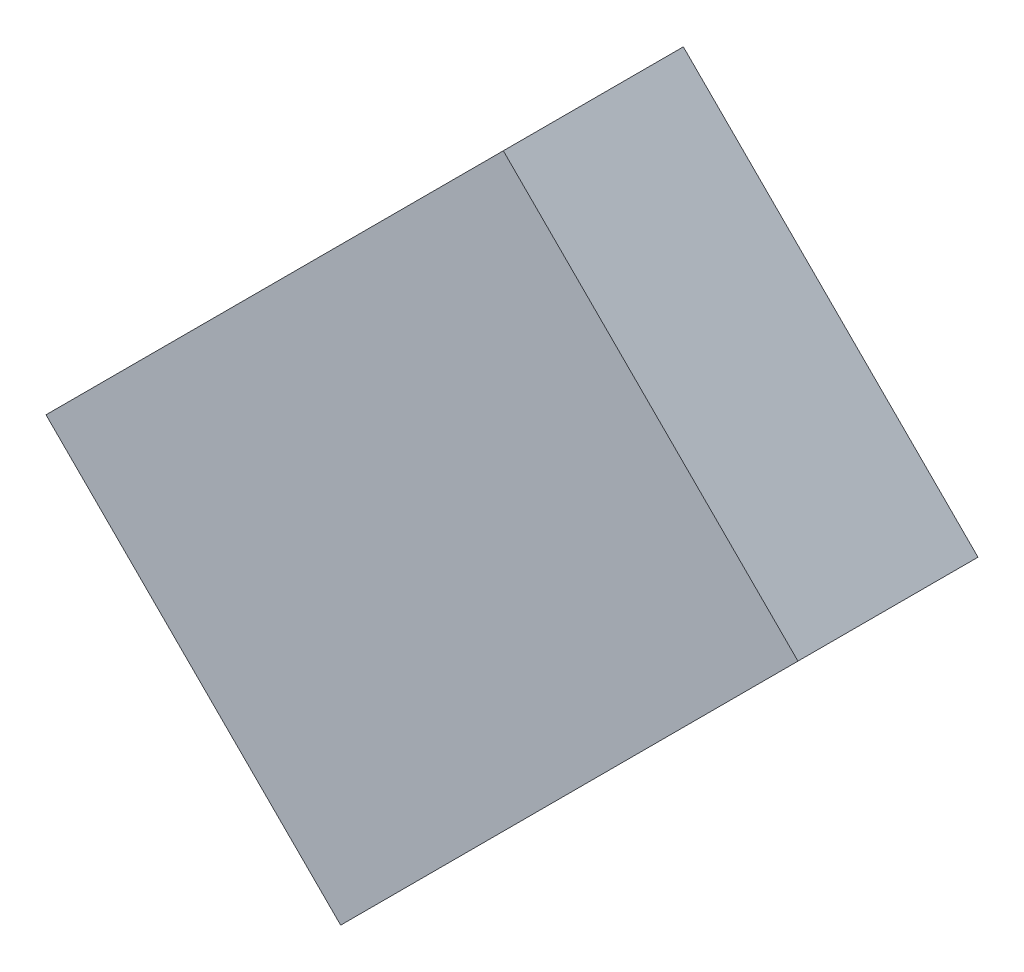
ISO-10303-21;
HEADER;
FILE_DESCRIPTION(('STEP AP214'),'2;1');
FILE_NAME('part.step','',(''),(''),'','','');
FILE_SCHEMA(('AUTOMOTIVE_DESIGN { 1 0 10303 214 1 1 1 1 }'));
ENDSEC;
DATA;
#1=APPLICATION_CONTEXT('core data for automotive mechanical design processes');
#2=APPLICATION_PROTOCOL_DEFINITION('international standard','automotive_design',2000,#1);
#3=PRODUCT_CONTEXT('',#1,'mechanical');
#4=PRODUCT('Part','Part','',(#3));
#5=PRODUCT_RELATED_PRODUCT_CATEGORY('part','',(#4));
#6=PRODUCT_DEFINITION_FORMATION('','',#4);
#7=PRODUCT_DEFINITION_CONTEXT('part definition',#1,'design');
#8=PRODUCT_DEFINITION('design','',#6,#7);
#9=PRODUCT_DEFINITION_SHAPE('','',#8);
#10=(LENGTH_UNIT() NAMED_UNIT(*) SI_UNIT(.MILLI.,.METRE.));
#11=(NAMED_UNIT(*) PLANE_ANGLE_UNIT() SI_UNIT($,.RADIAN.));
#12=(NAMED_UNIT(*) SI_UNIT($,.STERADIAN.) SOLID_ANGLE_UNIT());
#13=UNCERTAINTY_MEASURE_WITH_UNIT(LENGTH_MEASURE(1.E-05),#10,'distance_accuracy_value','');
#14=(GEOMETRIC_REPRESENTATION_CONTEXT(3) GLOBAL_UNCERTAINTY_ASSIGNED_CONTEXT((#13)) GLOBAL_UNIT_ASSIGNED_CONTEXT((#10,
#11,#12)) REPRESENTATION_CONTEXT('',''));
#15=CARTESIAN_POINT('',(0.,0.,0.));
#16=DIRECTION('',(0.,0.,1.));
#17=DIRECTION('',(1.,0.,0.));
#18=AXIS2_PLACEMENT_3D('',#15,#16,#17);
#19=CARTESIAN_POINT('',(-22.7428134217766,-1.20016133795845,0.0240009761019317));
#20=CARTESIAN_POINT('',(-22.7428134017478,-1.20016130133728,-0.623999023898068));
#21=CARTESIAN_POINT('',(-21.0966688351743,0.445983248643856,0.0240011200124011));
#22=CARTESIAN_POINT('',(-21.0966688151455,0.445983285265022,-0.623998879987599));
#23=(BOUNDED_SURFACE() B_SPLINE_SURFACE(1,1,((#19,#20),(#21,#22)),.UNSPECIFIED.,.F.,.F.,
.F.) B_SPLINE_SURFACE_WITH_KNOTS((2,2),(2,2),(-0.00116400000000004,0.001164),(-2.4E-05,
0.000624),.UNSPECIFIED.) GEOMETRIC_REPRESENTATION_ITEM() RATIONAL_B_SPLINE_SURFACE(((1.,1.),(1.,1.))) REPRESENTATION_ITEM('') SURFACE());
#24=CARTESIAN_POINT('',(-21.2338475323648,0.308804566663068,-0.569998891980138));
#25=CARTESIAN_POINT('',(-21.2338475490554,0.30880453614543,-0.029998891980138));
#26=(BOUNDED_CURVE() B_SPLINE_CURVE(1,(#24,#25),.UNSPECIFIED.,.F.,
.F.) B_SPLINE_CURVE_WITH_KNOTS((2,2),(-0.00054,0.),
.UNSPECIFIED.) CURVE() GEOMETRIC_REPRESENTATION_ITEM() RATIONAL_B_SPLINE_CURVE((1.,1.)) REPRESENTATION_ITEM(''));
#27=CARTESIAN_POINT('',(-21.2338475323648,0.308804566663073,-0.569998891980138));
#28=VERTEX_POINT('',#27);
#29=CARTESIAN_POINT('',(-21.2338475490554,0.30880453614543,-0.029998891980138));
#30=VERTEX_POINT('',#29);
#31=EDGE_CURVE('E75',#28,#30,#26,.T.);
#32=CARTESIAN_POINT('',(-22.6056346878667,-1.06298258883883,-0.569999011905529));
#33=CARTESIAN_POINT('',(-21.2338475323648,0.308804566663073,-0.569998891980138));
#34=(BOUNDED_CURVE() B_SPLINE_CURVE(1,(#32,#33),.UNSPECIFIED.,.F.,
.F.) B_SPLINE_CURVE_WITH_KNOTS((2,2),(-0.00194,0.),
.UNSPECIFIED.) CURVE() GEOMETRIC_REPRESENTATION_ITEM() RATIONAL_B_SPLINE_CURVE((1.,1.)) REPRESENTATION_ITEM(''));
#35=CARTESIAN_POINT('',(-22.6056346878667,-1.06298258883883,-0.569999011905529));
#36=VERTEX_POINT('',#35);
#37=EDGE_CURVE('E66',#36,#28,#34,.T.);
#38=CARTESIAN_POINT('',(-22.6056347045573,-1.06298261935647,-0.0299990119055293));
#39=CARTESIAN_POINT('',(-22.6056346878667,-1.06298258883883,-0.569999011905529));
#40=(BOUNDED_CURVE() B_SPLINE_CURVE(1,(#38,#39),.UNSPECIFIED.,.F.,
.F.) B_SPLINE_CURVE_WITH_KNOTS((2,2),(0.,0.00054),
.UNSPECIFIED.) CURVE() GEOMETRIC_REPRESENTATION_ITEM() RATIONAL_B_SPLINE_CURVE((1.,1.)) REPRESENTATION_ITEM(''));
#41=CARTESIAN_POINT('',(-22.6056347045573,-1.06298261935647,-0.0299990119055293));
#42=VERTEX_POINT('',#41);
#43=EDGE_CURVE('E114',#42,#36,#40,.T.);
#44=CARTESIAN_POINT('',(-21.2338475490554,0.30880453614543,-0.029998891980138));
#45=CARTESIAN_POINT('',(-22.6056347045573,-1.06298261935647,-0.0299990119055292));
#46=(BOUNDED_CURVE() B_SPLINE_CURVE(1,(#44,#45),.UNSPECIFIED.,.F.,
.F.) B_SPLINE_CURVE_WITH_KNOTS((2,2),(0.,0.00194),
.UNSPECIFIED.) CURVE() GEOMETRIC_REPRESENTATION_ITEM() RATIONAL_B_SPLINE_CURVE((1.,1.)) REPRESENTATION_ITEM(''));
#47=EDGE_CURVE('E32',#30,#42,#46,.T.);
#48=ORIENTED_EDGE('',*,*,#31,.F.);
#49=ORIENTED_EDGE('',*,*,#37,.F.);
#50=ORIENTED_EDGE('',*,*,#43,.F.);
#51=ORIENTED_EDGE('',*,*,#47,.F.);
#52=EDGE_LOOP('',(#48,#49,#50,#51));
#53=FACE_BOUND('',#52,.T.);
#54=ADVANCED_FACE('F17',(#53),#23,.T.);
#55=CARTESIAN_POINT('',(-20.2127853586911,-0.437900227839301,0.0240010973800788));
#56=CARTESIAN_POINT('',(-20.2127853386624,-0.437900191218136,-0.623998902619921));
#57=CARTESIAN_POINT('',(-21.8589299452935,-2.08404481444162,0.0240009534696094));
#58=CARTESIAN_POINT('',(-21.8589299252647,-2.08404477782046,-0.62399904653039));
#59=(BOUNDED_SURFACE() B_SPLINE_SURFACE(1,1,((#55,#56),(#57,#58)),.UNSPECIFIED.,.F.,.F.,
.F.) B_SPLINE_SURFACE_WITH_KNOTS((2,2),(2,2),(-0.00116400000000002,0.00116400000000004),
(-2.4E-05,0.000624),
.UNSPECIFIED.) GEOMETRIC_REPRESENTATION_ITEM() RATIONAL_B_SPLINE_SURFACE(((1.,1.),(1.,1.))) REPRESENTATION_ITEM('') SURFACE());
#60=CARTESIAN_POINT('',(-20.3499640558817,-0.575078909820121,-0.56999891461246));
#61=CARTESIAN_POINT('',(-20.3499640725723,-0.575078940337759,-0.0299989146124603));
#62=(BOUNDED_CURVE() B_SPLINE_CURVE(1,(#60,#61),.UNSPECIFIED.,.F.,
.F.) B_SPLINE_CURVE_WITH_KNOTS((2,2),(-0.00054,0.),
.UNSPECIFIED.) CURVE() GEOMETRIC_REPRESENTATION_ITEM() RATIONAL_B_SPLINE_CURVE((1.,1.)) REPRESENTATION_ITEM(''));
#63=CARTESIAN_POINT('',(-20.3499640558816,-0.575078909820115,-0.56999891461246));
#64=VERTEX_POINT('',#63);
#65=CARTESIAN_POINT('',(-20.3499640725723,-0.575078940337759,-0.0299989146124603));
#66=VERTEX_POINT('',#65);
#67=EDGE_CURVE('E80',#64,#66,#62,.T.);
#68=CARTESIAN_POINT('',(-20.3499640725723,-0.575078940337759,-0.0299989146124603));
#69=CARTESIAN_POINT('',(-21.7217512280742,-1.94686609583966,-0.0299990345378515));
#70=(BOUNDED_CURVE() B_SPLINE_CURVE(1,(#68,#69),.UNSPECIFIED.,.F.,
.F.) B_SPLINE_CURVE_WITH_KNOTS((2,2),(0.,0.00194),
.UNSPECIFIED.) CURVE() GEOMETRIC_REPRESENTATION_ITEM() RATIONAL_B_SPLINE_CURVE((1.,1.)) REPRESENTATION_ITEM(''));
#71=CARTESIAN_POINT('',(-21.7217512280742,-1.94686609583966,-0.0299990345378515));
#72=VERTEX_POINT('',#71);
#73=EDGE_CURVE('E11',#66,#72,#70,.T.);
#74=CARTESIAN_POINT('',(-21.7217512280742,-1.94686609583966,-0.0299990345378515));
#75=CARTESIAN_POINT('',(-21.7217512113836,-1.94686606532202,-0.569999034537851));
#76=(BOUNDED_CURVE() B_SPLINE_CURVE(1,(#74,#75),.UNSPECIFIED.,.F.,
.F.) B_SPLINE_CURVE_WITH_KNOTS((2,2),(0.,0.00054),
.UNSPECIFIED.) CURVE() GEOMETRIC_REPRESENTATION_ITEM() RATIONAL_B_SPLINE_CURVE((1.,1.)) REPRESENTATION_ITEM(''));
#77=CARTESIAN_POINT('',(-21.7217512113835,-1.94686606532201,-0.569999034537851));
#78=VERTEX_POINT('',#77);
#79=EDGE_CURVE('E106',#72,#78,#76,.T.);
#80=CARTESIAN_POINT('',(-21.7217512113835,-1.94686606532201,-0.569999034537851));
#81=CARTESIAN_POINT('',(-20.3499640558816,-0.575078909820115,-0.56999891461246));
#82=(BOUNDED_CURVE() B_SPLINE_CURVE(1,(#80,#81),.UNSPECIFIED.,.F.,
.F.) B_SPLINE_CURVE_WITH_KNOTS((2,2),(-0.00194,0.),
.UNSPECIFIED.) CURVE() GEOMETRIC_REPRESENTATION_ITEM() RATIONAL_B_SPLINE_CURVE((1.,1.)) REPRESENTATION_ITEM(''));
#83=EDGE_CURVE('E58',#78,#64,#82,.T.);
#84=ORIENTED_EDGE('',*,*,#67,.T.);
#85=ORIENTED_EDGE('',*,*,#73,.T.);
#86=ORIENTED_EDGE('',*,*,#79,.T.);
#87=ORIENTED_EDGE('',*,*,#83,.T.);
#88=EDGE_LOOP('',(#84,#85,#86,#87));
#89=FACE_BOUND('',#88,.T.);
#90=ADVANCED_FACE('F197',(#89),#59,.T.);
#91=CARTESIAN_POINT('',(-21.1850571811535,0.534371599343952,-0.0299988777243668));
#92=CARTESIAN_POINT('',(-20.1243970093737,-0.526288572435822,-0.0299989048831533));
#93=CARTESIAN_POINT('',(-22.8312017677559,-1.11177298725839,-0.0299990216348363));
#94=CARTESIAN_POINT('',(-21.7705415959761,-2.17243315903817,-0.0299990487936227));
#95=(BOUNDED_SURFACE() B_SPLINE_SURFACE(1,1,((#91,#92),(#93,#94)),.UNSPECIFIED.,.F.,.F.,
.F.) B_SPLINE_SURFACE_WITH_KNOTS((2,2),(2,2),(-0.000194000000000006,0.00213400000000009),
(0.00188875271570299,0.00338875271570293),
.UNSPECIFIED.) GEOMETRIC_REPRESENTATION_ITEM() RATIONAL_B_SPLINE_SURFACE(((1.,1.),(1.,1.))) REPRESENTATION_ITEM('') SURFACE());
#96=CARTESIAN_POINT('',(-21.2338475490554,0.30880453614544,-0.0299988919801381));
#97=CARTESIAN_POINT('',(-20.3499640725722,-0.575078940337704,-0.0299989146124602));
#98=(BOUNDED_CURVE() B_SPLINE_CURVE(1,(#96,#97),.UNSPECIFIED.,.F.,
.F.) B_SPLINE_CURVE_WITH_KNOTS((2,2),(0.00201375271570299,0.00326375271570294),
.UNSPECIFIED.) CURVE() GEOMETRIC_REPRESENTATION_ITEM() RATIONAL_B_SPLINE_CURVE((1.,1.)) REPRESENTATION_ITEM(''));
#99=EDGE_CURVE('E23',#30,#66,#98,.T.);
#100=CARTESIAN_POINT('',(-22.6056347045573,-1.06298261935651,-0.0299990119055294));
#101=CARTESIAN_POINT('',(-21.7217512280742,-1.94686609583966,-0.0299990345378515));
#102=(BOUNDED_CURVE() B_SPLINE_CURVE(1,(#100,#101),.UNSPECIFIED.,.F.,
.F.) B_SPLINE_CURVE_WITH_KNOTS((2,2),(0.00201375271570306,0.003263752715703),
.UNSPECIFIED.) CURVE() GEOMETRIC_REPRESENTATION_ITEM() RATIONAL_B_SPLINE_CURVE((1.,1.)) REPRESENTATION_ITEM(''));
#103=EDGE_CURVE('E115',#42,#72,#102,.T.);
#104=ORIENTED_EDGE('',*,*,#99,.F.);
#105=ORIENTED_EDGE('',*,*,#47,.T.);
#106=ORIENTED_EDGE('',*,*,#103,.T.);
#107=ORIENTED_EDGE('',*,*,#73,.F.);
#108=EDGE_LOOP('',(#104,#105,#106,#107));
#109=FACE_BOUND('',#108,.T.);
#110=ADVANCED_FACE('F201',(#109),#95,.T.);
#111=CARTESIAN_POINT('',(-21.6333628820949,-2.03525444653976,0.0240009631989164));
#112=CARTESIAN_POINT('',(-21.6333628620662,-2.0352544099186,-0.623999036801084));
#113=CARTESIAN_POINT('',(-22.6940230538748,-0.974594274759931,0.0240009903577029));
#114=CARTESIAN_POINT('',(-22.694023033846,-0.974594238138766,-0.623999009642297));
#115=(BOUNDED_SURFACE() B_SPLINE_SURFACE(1,1,((#111,#112),(#113,#114)),.UNSPECIFIED.,.F.,.F.,
.F.) B_SPLINE_SURFACE_WITH_KNOTS((2,2),(2,2),(-0.00338875271570304,-0.00188875271570302),
(-5.4E-05,0.000594),
.UNSPECIFIED.) GEOMETRIC_REPRESENTATION_ITEM() RATIONAL_B_SPLINE_SURFACE(((1.,1.),(1.,1.))) REPRESENTATION_ITEM('') SURFACE());
#116=CARTESIAN_POINT('',(-22.6056346878667,-1.06298258883882,-0.569999011905529));
#117=CARTESIAN_POINT('',(-21.7217512113835,-1.94686606532201,-0.569999034537851));
#118=(BOUNDED_CURVE() B_SPLINE_CURVE(1,(#116,#117),.UNSPECIFIED.,.F.,
.F.) B_SPLINE_CURVE_WITH_KNOTS((2,2),(0.00201375271570299,0.003263752715703),
.UNSPECIFIED.) CURVE() GEOMETRIC_REPRESENTATION_ITEM() RATIONAL_B_SPLINE_CURVE((1.,1.)) REPRESENTATION_ITEM(''));
#119=EDGE_CURVE('E71',#36,#78,#118,.T.);
#120=ORIENTED_EDGE('',*,*,#103,.F.);
#121=ORIENTED_EDGE('',*,*,#43,.T.);
#122=ORIENTED_EDGE('',*,*,#119,.T.);
#123=ORIENTED_EDGE('',*,*,#79,.F.);
#124=EDGE_LOOP('',(#120,#121,#122,#123));
#125=FACE_BOUND('',#124,.T.);
#126=ADVANCED_FACE('F215',(#125),#115,.T.);
#127=CARTESIAN_POINT('',(-21.1850571644629,0.534371629861594,-0.569998877724366));
#128=CARTESIAN_POINT('',(-22.8312017510652,-1.1117729567407,-0.569999021634835));
#129=CARTESIAN_POINT('',(-20.1243969926831,-0.526288541918243,-0.569998904883152));
#130=CARTESIAN_POINT('',(-21.7705415792854,-2.17243312852053,-0.569999048793622));
#131=(BOUNDED_SURFACE() B_SPLINE_SURFACE(1,1,((#127,#128),(#129,#130)),.UNSPECIFIED.,.F.,.F.,
.F.) B_SPLINE_SURFACE_WITH_KNOTS((2,2),(2,2),(0.00188875271570299,0.00338875271570301),
(-0.000194,0.002134),
.UNSPECIFIED.) GEOMETRIC_REPRESENTATION_ITEM() RATIONAL_B_SPLINE_SURFACE(((1.,1.),(1.,1.))) REPRESENTATION_ITEM('') SURFACE());
#132=CARTESIAN_POINT('',(-21.2338475323648,0.308804566663081,-0.569998891980137));
#133=CARTESIAN_POINT('',(-20.3499640558816,-0.575078909820112,-0.569998914612459));
#134=(BOUNDED_CURVE() B_SPLINE_CURVE(1,(#132,#133),.UNSPECIFIED.,.F.,
.F.) B_SPLINE_CURVE_WITH_KNOTS((2,2),(0.00201375271570299,0.003263752715703),
.UNSPECIFIED.) CURVE() GEOMETRIC_REPRESENTATION_ITEM() RATIONAL_B_SPLINE_CURVE((1.,1.)) REPRESENTATION_ITEM(''));
#135=EDGE_CURVE('E69',#28,#64,#134,.T.);
#136=ORIENTED_EDGE('',*,*,#119,.F.);
#137=ORIENTED_EDGE('',*,*,#37,.T.);
#138=ORIENTED_EDGE('',*,*,#135,.T.);
#139=ORIENTED_EDGE('',*,*,#83,.F.);
#140=EDGE_LOOP('',(#136,#137,#138,#139));
#141=FACE_BOUND('',#140,.T.);
#142=ADVANCED_FACE('F67',(#141),#131,.T.);
#143=CARTESIAN_POINT('',(-21.3222358983728,0.397192880742021,0.0240011102830942));
#144=CARTESIAN_POINT('',(-21.322235878344,0.397192917363187,-0.623998889716906));
#145=CARTESIAN_POINT('',(-20.261575726593,-0.663467291037811,0.0240010831243077));
#146=CARTESIAN_POINT('',(-20.2615757065642,-0.663467254416646,-0.623998916875692));
#147=(BOUNDED_SURFACE() B_SPLINE_SURFACE(1,1,((#143,#144),(#145,#146)),.UNSPECIFIED.,.F.,.F.,
.F.) B_SPLINE_SURFACE_WITH_KNOTS((2,2),(2,2),(0.00188875271570295,0.00338875271570297),
(-5.4E-05,0.000594),
.UNSPECIFIED.) GEOMETRIC_REPRESENTATION_ITEM() RATIONAL_B_SPLINE_SURFACE(((1.,1.),(1.,1.))) REPRESENTATION_ITEM('') SURFACE());
#148=ORIENTED_EDGE('',*,*,#135,.F.);
#149=ORIENTED_EDGE('',*,*,#31,.T.);
#150=ORIENTED_EDGE('',*,*,#99,.T.);
#151=ORIENTED_EDGE('',*,*,#67,.F.);
#152=EDGE_LOOP('',(#148,#149,#150,#151));
#153=FACE_BOUND('',#152,.T.);
#154=ADVANCED_FACE('F19',(#153),#147,.T.);
#155=CLOSED_SHELL('',(#54,#90,#110,#126,#142,#154));
#156=MANIFOLD_SOLID_BREP('B1',#155);
#157=ADVANCED_BREP_SHAPE_REPRESENTATION('',(#18,#156),#14);
#158=SHAPE_DEFINITION_REPRESENTATION(#9,#157);
ENDSEC;
END-ISO-10303-21;
